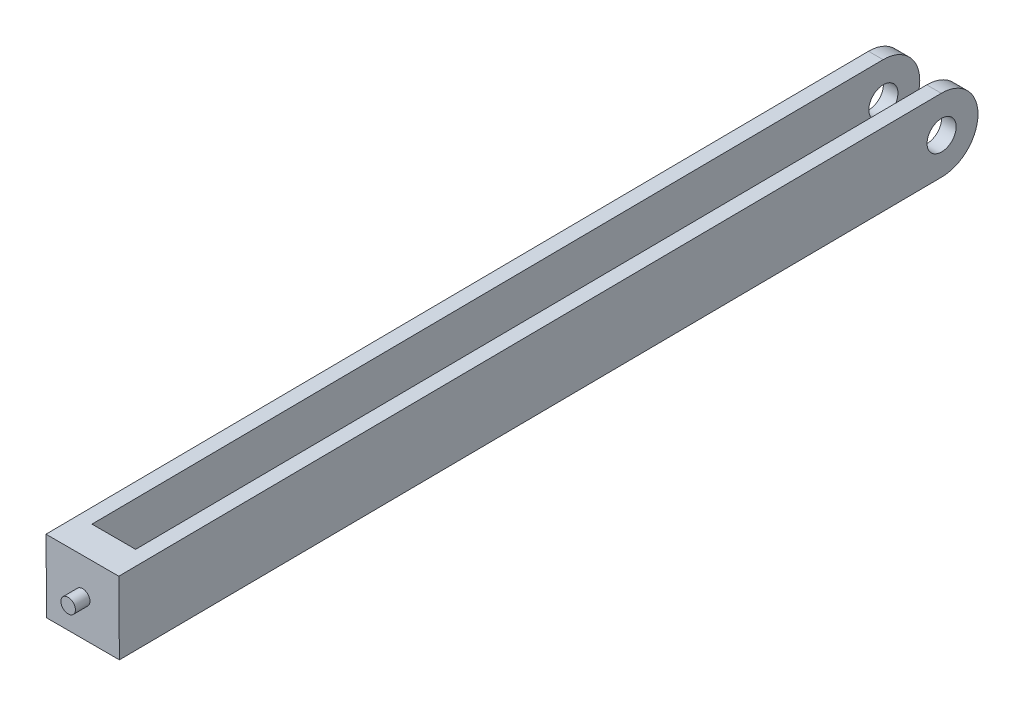
ISO-10303-21;
HEADER;
FILE_DESCRIPTION(('STEP AP214'),'2;1');
FILE_NAME('part.step','',(''),(''),'','','');
FILE_SCHEMA(('AUTOMOTIVE_DESIGN { 1 0 10303 214 1 1 1 1 }'));
ENDSEC;
DATA;
#1=APPLICATION_CONTEXT('core data for automotive mechanical design processes');
#2=APPLICATION_PROTOCOL_DEFINITION('international standard','automotive_design',2000,#1);
#3=PRODUCT_CONTEXT('',#1,'mechanical');
#4=PRODUCT('Part','Part','',(#3));
#5=PRODUCT_RELATED_PRODUCT_CATEGORY('part','',(#4));
#6=PRODUCT_DEFINITION_FORMATION('','',#4);
#7=PRODUCT_DEFINITION_CONTEXT('part definition',#1,'design');
#8=PRODUCT_DEFINITION('design','',#6,#7);
#9=PRODUCT_DEFINITION_SHAPE('','',#8);
#10=(LENGTH_UNIT() NAMED_UNIT(*) SI_UNIT(.MILLI.,.METRE.));
#11=(NAMED_UNIT(*) PLANE_ANGLE_UNIT() SI_UNIT($,.RADIAN.));
#12=(NAMED_UNIT(*) SI_UNIT($,.STERADIAN.) SOLID_ANGLE_UNIT());
#13=UNCERTAINTY_MEASURE_WITH_UNIT(LENGTH_MEASURE(1.E-05),#10,'distance_accuracy_value','');
#14=(GEOMETRIC_REPRESENTATION_CONTEXT(3) GLOBAL_UNCERTAINTY_ASSIGNED_CONTEXT((#13)) GLOBAL_UNIT_ASSIGNED_CONTEXT((#10,
#11,#12)) REPRESENTATION_CONTEXT('',''));
#15=CARTESIAN_POINT('',(0.,0.,0.));
#16=DIRECTION('',(0.,0.,1.));
#17=DIRECTION('',(1.,0.,0.));
#18=AXIS2_PLACEMENT_3D('',#15,#16,#17);
#19=CARTESIAN_POINT('',(25.,6.48746982843481,150.446695240058));
#20=DIRECTION('',(1.,0.,0.));
#21=DIRECTION('',(0.,0.,-1.));
#22=AXIS2_PLACEMENT_3D('',#19,#20,#21);
#23=PLANE('',#22);
#24=CARTESIAN_POINT('',(25.,9.03316173444001,-149.553304759941));
#25=DIRECTION('',(1.,0.,0.));
#26=DIRECTION('',(0.,0.,-1.));
#27=AXIS2_PLACEMENT_3D('',#24,#25,#26);
#28=CIRCLE('',#27,4.99999999999999);
#29=CARTESIAN_POINT('',(25.,9.03316173444001,-154.553304759942));
#30=VERTEX_POINT('',#29);
#31=EDGE_CURVE('E197',#30,#30,#28,.T.);
#32=ORIENTED_EDGE('',*,*,#31,.F.);
#33=EDGE_LOOP('',(#32));
#34=FACE_BOUND('',#33,.T.);
#35=DIRECTION('',(0.,-0.00848533419435304,0.999963998903766));
#36=VECTOR('',#35,1.);
#37=CARTESIAN_POINT('',(25.,18.9870198147319,150.552761917488));
#38=LINE('',#37,#36);
#39=CARTESIAN_POINT('',(25.,21.5327117207371,-149.447238082512));
#40=VERTEX_POINT('',#39);
#41=CARTESIAN_POINT('',(25.,19.1355131631331,133.053391936672));
#42=VERTEX_POINT('',#41);
#43=EDGE_CURVE('E206',#40,#42,#38,.T.);
#44=ORIENTED_EDGE('',*,*,#43,.T.);
#45=DIRECTION('',(0.,0.999963998903766,0.00848533419435316));
#46=VECTOR('',#45,1.);
#47=CARTESIAN_POINT('',(25.,20.2089025406423,133.062500332173));
#48=LINE('',#47,#46);
#49=CARTESIAN_POINT('',(25.,-5.86358680946109,132.841258581813));
#50=VERTEX_POINT('',#49);
#51=EDGE_CURVE('E56',#50,#42,#48,.T.);
#52=ORIENTED_EDGE('',*,*,#51,.F.);
#53=DIRECTION('',(0.,0.00848533419435304,-0.999963998903766));
#54=VECTOR('',#53,1.);
#55=CARTESIAN_POINT('',(25.,-6.01208015786226,150.340628562629));
#56=LINE('',#55,#54);
#57=CARTESIAN_POINT('',(25.,-3.46638825185706,-149.659371437371));
#58=VERTEX_POINT('',#57);
#59=EDGE_CURVE('E127',#50,#58,#56,.T.);
#60=ORIENTED_EDGE('',*,*,#59,.T.);
#61=CARTESIAN_POINT('',(25.,9.03316173444001,-149.553304759941));
#62=DIRECTION('',(1.,0.,0.));
#63=DIRECTION('',(0.,0.,-1.));
#64=AXIS2_PLACEMENT_3D('',#61,#62,#63);
#65=CIRCLE('',#64,12.5);
#66=EDGE_CURVE('E132',#58,#40,#65,.T.);
#67=ORIENTED_EDGE('',*,*,#66,.T.);
#68=EDGE_LOOP('',(#44,#52,#60,#67));
#69=FACE_BOUND('',#68,.T.);
#70=ADVANCED_FACE('F41',(#34,#69),#23,.T.);
#71=CARTESIAN_POINT('',(0.,6.48746982843481,150.446695240058));
#72=DIRECTION('',(1.,0.,0.));
#73=DIRECTION('',(0.,0.,-1.));
#74=AXIS2_PLACEMENT_3D('',#71,#72,#73);
#75=PLANE('',#74);
#76=CARTESIAN_POINT('',(0.,9.03316173444001,-149.553304759941));
#77=DIRECTION('',(1.,0.,0.));
#78=DIRECTION('',(0.,0.,-1.));
#79=AXIS2_PLACEMENT_3D('',#76,#77,#78);
#80=CIRCLE('',#79,4.99999999999999);
#81=CARTESIAN_POINT('',(0.,9.03316173444001,-154.553304759942));
#82=VERTEX_POINT('',#81);
#83=EDGE_CURVE('E196',#82,#82,#80,.T.);
#84=ORIENTED_EDGE('',*,*,#83,.T.);
#85=EDGE_LOOP('',(#84));
#86=FACE_BOUND('',#85,.T.);
#87=DIRECTION('',(0.,-0.999963998903766,-0.00848533419435316));
#88=VECTOR('',#87,1.);
#89=CARTESIAN_POINT('',(0.,20.2089025406423,133.062500332173));
#90=LINE('',#89,#88);
#91=CARTESIAN_POINT('',(0.,19.1355131631331,133.053391936672));
#92=VERTEX_POINT('',#91);
#93=CARTESIAN_POINT('',(0.,-5.86358680946109,132.841258581813));
#94=VERTEX_POINT('',#93);
#95=EDGE_CURVE('E105',#92,#94,#90,.T.);
#96=ORIENTED_EDGE('',*,*,#95,.F.);
#97=DIRECTION('',(0.,-0.00848533419435304,0.999963998903766));
#98=VECTOR('',#97,1.);
#99=CARTESIAN_POINT('',(0.,18.9870198147319,150.552761917488));
#100=LINE('',#99,#98);
#101=CARTESIAN_POINT('',(0.,21.5327117207371,-149.447238082512));
#102=VERTEX_POINT('',#101);
#103=EDGE_CURVE('E116',#102,#92,#100,.T.);
#104=ORIENTED_EDGE('',*,*,#103,.F.);
#105=CARTESIAN_POINT('',(0.,9.03316173444001,-149.553304759941));
#106=DIRECTION('',(1.,0.,0.));
#107=DIRECTION('',(0.,0.,-1.));
#108=AXIS2_PLACEMENT_3D('',#105,#106,#107);
#109=CIRCLE('',#108,12.5);
#110=CARTESIAN_POINT('',(0.,-3.46638825185706,-149.659371437371));
#111=VERTEX_POINT('',#110);
#112=EDGE_CURVE('E128',#111,#102,#109,.T.);
#113=ORIENTED_EDGE('',*,*,#112,.F.);
#114=DIRECTION('',(0.,0.00848533419435304,-0.999963998903766));
#115=VECTOR('',#114,1.);
#116=CARTESIAN_POINT('',(0.,-6.01208015786226,150.340628562629));
#117=LINE('',#116,#115);
#118=EDGE_CURVE('E117',#94,#111,#117,.T.);
#119=ORIENTED_EDGE('',*,*,#118,.F.);
#120=EDGE_LOOP('',(#96,#104,#113,#119));
#121=FACE_BOUND('',#120,.T.);
#122=ADVANCED_FACE('F114',(#86,#121),#75,.F.);
#123=CARTESIAN_POINT('',(25.,-6.01208015786226,150.340628562629));
#124=DIRECTION('',(0.,0.999963998903766,0.00848533419435304));
#125=DIRECTION('',(0.,-0.00848533419435304,0.999963998903766));
#126=AXIS2_PLACEMENT_3D('',#123,#124,#125);
#127=PLANE('',#126);
#128=DIRECTION('',(1.,0.,0.));
#129=VECTOR('',#128,1.);
#130=CARTESIAN_POINT('',(25.,-5.86358680946108,132.841258581813));
#131=LINE('',#130,#129);
#132=EDGE_CURVE('E171',#94,#50,#131,.T.);
#133=ORIENTED_EDGE('',*,*,#132,.F.);
#134=ORIENTED_EDGE('',*,*,#118,.T.);
#135=DIRECTION('',(-1.,0.,0.));
#136=VECTOR('',#135,1.);
#137=CARTESIAN_POINT('',(25.,-3.46638825185706,-149.659371437371));
#138=LINE('',#137,#136);
#139=CARTESIAN_POINT('',(5.,-3.46638825185706,-149.659371437371));
#140=VERTEX_POINT('',#139);
#141=EDGE_CURVE('E141',#140,#111,#138,.T.);
#142=ORIENTED_EDGE('',*,*,#141,.F.);
#143=DIRECTION('',(0.,-0.00848533419435304,0.999963998903766));
#144=VECTOR('',#143,1.);
#145=CARTESIAN_POINT('',(5.00000000000004,-6.01208015786226,150.340628562629));
#146=LINE('',#145,#144);
#147=CARTESIAN_POINT('',(5.00000000000004,-5.77381168962412,122.261605997949));
#148=VERTEX_POINT('',#147);
#149=EDGE_CURVE('E189',#140,#148,#146,.T.);
#150=ORIENTED_EDGE('',*,*,#149,.T.);
#151=DIRECTION('',(1.,0.,0.));
#152=VECTOR('',#151,1.);
#153=CARTESIAN_POINT('',(25.,-5.77381168962412,122.261605997949));
#154=LINE('',#153,#152);
#155=CARTESIAN_POINT('',(20.,-5.77381168962412,122.261605997949));
#156=VERTEX_POINT('',#155);
#157=EDGE_CURVE('E193',#148,#156,#154,.T.);
#158=ORIENTED_EDGE('',*,*,#157,.T.);
#159=DIRECTION('',(0.,0.00848533419435304,-0.999963998903766));
#160=VECTOR('',#159,1.);
#161=CARTESIAN_POINT('',(20.,-6.01208015786226,150.340628562629));
#162=LINE('',#161,#160);
#163=CARTESIAN_POINT('',(20.,-3.46638825185706,-149.659371437371));
#164=VERTEX_POINT('',#163);
#165=EDGE_CURVE('E156',#156,#164,#162,.T.);
#166=ORIENTED_EDGE('',*,*,#165,.T.);
#167=EDGE_CURVE('E142',#58,#164,#138,.T.);
#168=ORIENTED_EDGE('',*,*,#167,.F.);
#169=ORIENTED_EDGE('',*,*,#59,.F.);
#170=EDGE_LOOP('',(#133,#134,#142,#150,#158,#166,#168,#169));
#171=FACE_BOUND('',#170,.T.);
#172=ADVANCED_FACE('F43',(#171),#127,.F.);
#173=CARTESIAN_POINT('',(25.,18.9870198147319,150.552761917488));
#174=DIRECTION('',(0.,-0.999963998903766,-0.00848533419435304));
#175=DIRECTION('',(0.,0.00848533419435304,-0.999963998903766));
#176=AXIS2_PLACEMENT_3D('',#173,#174,#175);
#177=PLANE('',#176);
#178=DIRECTION('',(-1.,0.,0.));
#179=VECTOR('',#178,1.);
#180=CARTESIAN_POINT('',(25.,19.1355131631331,133.053391936672));
#181=LINE('',#180,#179);
#182=EDGE_CURVE('E11',#42,#92,#181,.T.);
#183=ORIENTED_EDGE('',*,*,#182,.F.);
#184=ORIENTED_EDGE('',*,*,#43,.F.);
#185=DIRECTION('',(-1.,0.,0.));
#186=VECTOR('',#185,1.);
#187=CARTESIAN_POINT('',(25.,21.5327117207371,-149.447238082512));
#188=LINE('',#187,#186);
#189=CARTESIAN_POINT('',(20.,21.5327117207371,-149.447238082512));
#190=VERTEX_POINT('',#189);
#191=EDGE_CURVE('E137',#40,#190,#188,.T.);
#192=ORIENTED_EDGE('',*,*,#191,.T.);
#193=DIRECTION('',(0.,-0.00848533419435304,0.999963998903766));
#194=VECTOR('',#193,1.);
#195=CARTESIAN_POINT('',(20.,18.9870198147319,150.552761917488));
#196=LINE('',#195,#194);
#197=CARTESIAN_POINT('',(20.,19.2270883701849,122.261605997949));
#198=VERTEX_POINT('',#197);
#199=EDGE_CURVE('E150',#190,#198,#196,.T.);
#200=ORIENTED_EDGE('',*,*,#199,.T.);
#201=DIRECTION('',(-1.,0.,0.));
#202=VECTOR('',#201,1.);
#203=CARTESIAN_POINT('',(25.,19.2270883701849,122.261605997949));
#204=LINE('',#203,#202);
#205=CARTESIAN_POINT('',(5.00000000000004,19.2270883701849,122.261605997949));
#206=VERTEX_POINT('',#205);
#207=EDGE_CURVE('E50',#198,#206,#204,.T.);
#208=ORIENTED_EDGE('',*,*,#207,.T.);
#209=DIRECTION('',(0.,0.00848533419435304,-0.999963998903766));
#210=VECTOR('',#209,1.);
#211=CARTESIAN_POINT('',(5.00000000000004,18.9870198147319,150.552761917488));
#212=LINE('',#211,#210);
#213=CARTESIAN_POINT('',(5.,21.5327117207371,-149.447238082512));
#214=VERTEX_POINT('',#213);
#215=EDGE_CURVE('E155',#206,#214,#212,.T.);
#216=ORIENTED_EDGE('',*,*,#215,.T.);
#217=EDGE_CURVE('E124',#214,#102,#188,.T.);
#218=ORIENTED_EDGE('',*,*,#217,.T.);
#219=ORIENTED_EDGE('',*,*,#103,.T.);
#220=EDGE_LOOP('',(#183,#184,#192,#200,#208,#216,#218,#219));
#221=FACE_BOUND('',#220,.T.);
#222=ADVANCED_FACE('F121',(#221),#177,.F.);
#223=CARTESIAN_POINT('',(25.,9.03316173444001,-149.553304759941));
#224=DIRECTION('',(-1.,0.,0.));
#225=DIRECTION('',(0.,0.,1.));
#226=AXIS2_PLACEMENT_3D('',#223,#224,#225);
#227=CYLINDRICAL_SURFACE('',#226,12.5);
#228=ORIENTED_EDGE('',*,*,#217,.F.);
#229=CARTESIAN_POINT('',(5.,9.03316173444001,-149.553304759941));
#230=DIRECTION('',(-1.,0.,0.));
#231=DIRECTION('',(0.,0.,1.));
#232=AXIS2_PLACEMENT_3D('',#229,#230,#231);
#233=CIRCLE('',#232,12.5);
#234=EDGE_CURVE('E185',#214,#140,#233,.T.);
#235=ORIENTED_EDGE('',*,*,#234,.T.);
#236=ORIENTED_EDGE('',*,*,#141,.T.);
#237=ORIENTED_EDGE('',*,*,#112,.T.);
#238=EDGE_LOOP('',(#228,#235,#236,#237));
#239=FACE_BOUND('',#238,.T.);
#240=ADVANCED_FACE('F214',(#239),#227,.T.);
#241=CARTESIAN_POINT('',(25.,9.03316173444001,-149.553304759941));
#242=DIRECTION('',(-1.,0.,0.));
#243=DIRECTION('',(0.,0.,1.));
#244=AXIS2_PLACEMENT_3D('',#241,#242,#243);
#245=CYLINDRICAL_SURFACE('',#244,4.99999999999999);
#246=CARTESIAN_POINT('',(5.,9.03316173444001,-149.553304759941));
#247=DIRECTION('',(-1.,0.,0.));
#248=DIRECTION('',(0.,0.,1.));
#249=AXIS2_PLACEMENT_3D('',#246,#247,#248);
#250=CIRCLE('',#249,4.99999999999999);
#251=CARTESIAN_POINT('',(5.00000000000001,9.03316173444001,-144.553304759941));
#252=VERTEX_POINT('',#251);
#253=EDGE_CURVE('E152',#252,#252,#250,.T.);
#254=ORIENTED_EDGE('',*,*,#253,.F.);
#255=EDGE_LOOP('',(#254));
#256=FACE_BOUND('',#255,.T.);
#257=ORIENTED_EDGE('',*,*,#83,.F.);
#258=EDGE_LOOP('',(#257));
#259=FACE_BOUND('',#258,.T.);
#260=ADVANCED_FACE('F266',(#256,#259),#245,.F.);
#261=ORIENTED_EDGE('',*,*,#167,.T.);
#262=CARTESIAN_POINT('',(20.,9.03316173444001,-149.553304759941));
#263=DIRECTION('',(1.,0.,0.));
#264=DIRECTION('',(0.,0.,-1.));
#265=AXIS2_PLACEMENT_3D('',#262,#263,#264);
#266=CIRCLE('',#265,12.5);
#267=EDGE_CURVE('E178',#164,#190,#266,.T.);
#268=ORIENTED_EDGE('',*,*,#267,.T.);
#269=ORIENTED_EDGE('',*,*,#191,.F.);
#270=ORIENTED_EDGE('',*,*,#66,.F.);
#271=EDGE_LOOP('',(#261,#268,#269,#270));
#272=FACE_BOUND('',#271,.T.);
#273=ADVANCED_FACE('F222',(#272),#227,.T.);
#274=CARTESIAN_POINT('',(20.,9.03316173444001,-149.553304759941));
#275=DIRECTION('',(1.,0.,0.));
#276=DIRECTION('',(0.,0.,-1.));
#277=AXIS2_PLACEMENT_3D('',#274,#275,#276);
#278=CIRCLE('',#277,4.99999999999999);
#279=CARTESIAN_POINT('',(20.,9.03316173444001,-154.553304759942));
#280=VERTEX_POINT('',#279);
#281=EDGE_CURVE('E146',#280,#280,#278,.T.);
#282=ORIENTED_EDGE('',*,*,#281,.F.);
#283=EDGE_LOOP('',(#282));
#284=FACE_BOUND('',#283,.T.);
#285=ORIENTED_EDGE('',*,*,#31,.T.);
#286=EDGE_LOOP('',(#285));
#287=FACE_BOUND('',#286,.T.);
#288=ADVANCED_FACE('F261',(#284,#287),#245,.F.);
#289=CARTESIAN_POINT('',(5.00000000000004,-15.,122.261605997949));
#290=DIRECTION('',(0.,0.,1.));
#291=DIRECTION('',(1.,0.,0.));
#292=AXIS2_PLACEMENT_3D('',#289,#290,#291);
#293=PLANE('',#292);
#294=DIRECTION('',(0.,1.,0.));
#295=VECTOR('',#294,1.);
#296=CARTESIAN_POINT('',(5.00000000000004,-15.,122.261605997949));
#297=LINE('',#296,#295);
#298=EDGE_CURVE('E64',#148,#206,#297,.T.);
#299=ORIENTED_EDGE('',*,*,#298,.T.);
#300=ORIENTED_EDGE('',*,*,#207,.F.);
#301=DIRECTION('',(0.,1.,0.));
#302=VECTOR('',#301,1.);
#303=CARTESIAN_POINT('',(20.,-15.,122.261605997949));
#304=LINE('',#303,#302);
#305=EDGE_CURVE('E151',#156,#198,#304,.T.);
#306=ORIENTED_EDGE('',*,*,#305,.F.);
#307=ORIENTED_EDGE('',*,*,#157,.F.);
#308=EDGE_LOOP('',(#299,#300,#306,#307));
#309=FACE_BOUND('',#308,.T.);
#310=ADVANCED_FACE('F162',(#309),#293,.F.);
#311=CARTESIAN_POINT('',(5.,-15.,-167.738394002051));
#312=DIRECTION('',(-1.,0.,0.));
#313=DIRECTION('',(0.,0.,1.));
#314=AXIS2_PLACEMENT_3D('',#311,#312,#313);
#315=PLANE('',#314);
#316=ORIENTED_EDGE('',*,*,#253,.T.);
#317=EDGE_LOOP('',(#316));
#318=FACE_BOUND('',#317,.T.);
#319=ORIENTED_EDGE('',*,*,#234,.F.);
#320=ORIENTED_EDGE('',*,*,#215,.F.);
#321=ORIENTED_EDGE('',*,*,#298,.F.);
#322=ORIENTED_EDGE('',*,*,#149,.F.);
#323=EDGE_LOOP('',(#319,#320,#321,#322));
#324=FACE_BOUND('',#323,.T.);
#325=ADVANCED_FACE('F218',(#318,#324),#315,.F.);
#326=CARTESIAN_POINT('',(20.,-15.,-167.738394002051));
#327=DIRECTION('',(1.,0.,0.));
#328=DIRECTION('',(0.,0.,-1.));
#329=AXIS2_PLACEMENT_3D('',#326,#327,#328);
#330=PLANE('',#329);
#331=ORIENTED_EDGE('',*,*,#281,.T.);
#332=EDGE_LOOP('',(#331));
#333=FACE_BOUND('',#332,.T.);
#334=ORIENTED_EDGE('',*,*,#305,.T.);
#335=ORIENTED_EDGE('',*,*,#199,.F.);
#336=ORIENTED_EDGE('',*,*,#267,.F.);
#337=ORIENTED_EDGE('',*,*,#165,.F.);
#338=EDGE_LOOP('',(#334,#335,#336,#337));
#339=FACE_BOUND('',#338,.T.);
#340=ADVANCED_FACE('F165',(#333,#339),#330,.F.);
#341=CARTESIAN_POINT('',(0.,-1.12758407684678,132.881446594557));
#342=DIRECTION('',(0.,-0.00848533419435316,0.999963998903766));
#343=DIRECTION('',(0.,-0.999963998903766,-0.00848533419435316));
#344=AXIS2_PLACEMENT_3D('',#341,#342,#343);
#345=PLANE('',#344);
#346=CARTESIAN_POINT('',(12.5,6.63596317683599,132.947325259243));
#347=DIRECTION('',(0.,-0.00848533419435316,0.999963998903766));
#348=DIRECTION('',(0.,-0.999963998903766,-0.00848533419435316));
#349=AXIS2_PLACEMENT_3D('',#346,#347,#348);
#350=CIRCLE('',#349,2.5);
#351=CARTESIAN_POINT('',(12.5,4.13605317957657,132.926111923757));
#352=VERTEX_POINT('',#351);
#353=EDGE_CURVE('E228',#352,#352,#350,.T.);
#354=ORIENTED_EDGE('',*,*,#353,.F.);
#355=EDGE_LOOP('',(#354));
#356=FACE_BOUND('',#355,.T.);
#357=ORIENTED_EDGE('',*,*,#132,.T.);
#358=ORIENTED_EDGE('',*,*,#51,.T.);
#359=ORIENTED_EDGE('',*,*,#182,.T.);
#360=ORIENTED_EDGE('',*,*,#95,.T.);
#361=EDGE_LOOP('',(#357,#358,#359,#360));
#362=FACE_BOUND('',#361,.T.);
#363=ADVANCED_FACE('F104',(#356,#362),#345,.T.);
#364=CARTESIAN_POINT('',(12.5,6.59353650586422,137.947145253761));
#365=DIRECTION('',(0.,0.00848533419435316,-0.999963998903766));
#366=DIRECTION('',(0.,0.999963998903766,0.00848533419435316));
#367=AXIS2_PLACEMENT_3D('',#364,#365,#366);
#368=CYLINDRICAL_SURFACE('',#367,2.5);
#369=CARTESIAN_POINT('',(12.5,6.59353650586422,137.947145253761));
#370=DIRECTION('',(0.,-0.00848533419435316,0.999963998903766));
#371=DIRECTION('',(0.,-0.999963998903766,-0.00848533419435316));
#372=AXIS2_PLACEMENT_3D('',#369,#370,#371);
#373=CIRCLE('',#372,2.5);
#374=CARTESIAN_POINT('',(12.5,4.0936265086048,137.925931918276));
#375=VERTEX_POINT('',#374);
#376=EDGE_CURVE('E119',#375,#375,#373,.T.);
#377=ORIENTED_EDGE('',*,*,#376,.F.);
#378=EDGE_LOOP('',(#377));
#379=FACE_BOUND('',#378,.T.);
#380=ORIENTED_EDGE('',*,*,#353,.T.);
#381=EDGE_LOOP('',(#380));
#382=FACE_BOUND('',#381,.T.);
#383=ADVANCED_FACE('F238',(#379,#382),#368,.T.);
#384=CARTESIAN_POINT('',(12.5,6.59353650586422,137.947145253761));
#385=DIRECTION('',(0.,-0.00848533419435316,0.999963998903766));
#386=DIRECTION('',(0.,-0.999963998903766,-0.00848533419435316));
#387=AXIS2_PLACEMENT_3D('',#384,#385,#386);
#388=PLANE('',#387);
#389=ORIENTED_EDGE('',*,*,#376,.T.);
#390=EDGE_LOOP('',(#389));
#391=FACE_BOUND('',#390,.T.);
#392=ADVANCED_FACE('F236',(#391),#388,.T.);
#393=CLOSED_SHELL('',(#70,#122,#172,#222,#240,#260,#273,#288,#310,#325,#340,#363,#383,#392));
#394=MANIFOLD_SOLID_BREP('B2',#393);
#395=ADVANCED_BREP_SHAPE_REPRESENTATION('',(#18,#394),#14);
#396=SHAPE_DEFINITION_REPRESENTATION(#9,#395);
ENDSEC;
END-ISO-10303-21;
